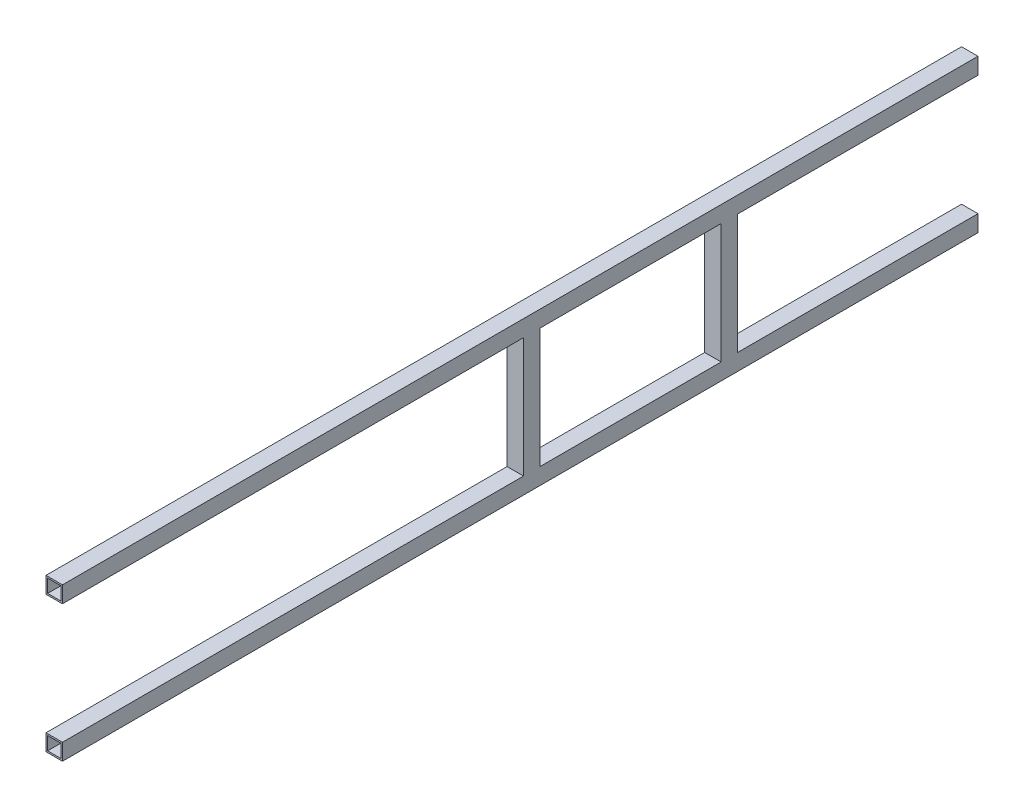
ISO-10303-21;
HEADER;
FILE_DESCRIPTION(('STEP AP214'),'2;1');
FILE_NAME('part.step','',(''),(''),'','','');
FILE_SCHEMA(('AUTOMOTIVE_DESIGN { 1 0 10303 214 1 1 1 1 }'));
ENDSEC;
DATA;
#1=APPLICATION_CONTEXT('core data for automotive mechanical design processes');
#2=APPLICATION_PROTOCOL_DEFINITION('international standard','automotive_design',2000,#1);
#3=PRODUCT_CONTEXT('',#1,'mechanical');
#4=PRODUCT('Part','Part','',(#3));
#5=PRODUCT_RELATED_PRODUCT_CATEGORY('part','',(#4));
#6=PRODUCT_DEFINITION_FORMATION('','',#4);
#7=PRODUCT_DEFINITION_CONTEXT('part definition',#1,'design');
#8=PRODUCT_DEFINITION('design','',#6,#7);
#9=PRODUCT_DEFINITION_SHAPE('','',#8);
#10=(LENGTH_UNIT() NAMED_UNIT(*) SI_UNIT(.MILLI.,.METRE.));
#11=(NAMED_UNIT(*) PLANE_ANGLE_UNIT() SI_UNIT($,.RADIAN.));
#12=(NAMED_UNIT(*) SI_UNIT($,.STERADIAN.) SOLID_ANGLE_UNIT());
#13=UNCERTAINTY_MEASURE_WITH_UNIT(LENGTH_MEASURE(1.E-05),#10,'distance_accuracy_value','');
#14=(GEOMETRIC_REPRESENTATION_CONTEXT(3) GLOBAL_UNCERTAINTY_ASSIGNED_CONTEXT((#13)) GLOBAL_UNIT_ASSIGNED_CONTEXT((#10,
#11,#12)) REPRESENTATION_CONTEXT('',''));
#15=CARTESIAN_POINT('',(0.,0.,0.));
#16=DIRECTION('',(0.,0.,1.));
#17=DIRECTION('',(1.,0.,0.));
#18=AXIS2_PLACEMENT_3D('',#15,#16,#17);
#19=CARTESIAN_POINT('',(-226.590724971136,-123.758693238811,500000.000000032));
#20=DIRECTION('',(1.,0.,0.));
#21=DIRECTION('',(0.,0.,-1.));
#22=AXIS2_PLACEMENT_3D('',#19,#20,#21);
#23=PLANE('',#22);
#24=DIRECTION('',(0.,0.,1.));
#25=VECTOR('',#24,1.);
#26=CARTESIAN_POINT('',(-226.59072497106,-118.745000000152,500000.000000032));
#27=LINE('',#26,#25);
#28=CARTESIAN_POINT('',(-226.590724971098,-118.745000000075,1797.05000000001));
#29=VERTEX_POINT('',#28);
#30=CARTESIAN_POINT('',(-226.590724971079,-118.745000000102,31.7499999999485));
#31=VERTEX_POINT('',#30);
#32=EDGE_CURVE('E222',#29,#31,#27,.F.);
#33=ORIENTED_EDGE('',*,*,#32,.T.);
#34=DIRECTION('',(0.,1.,0.));
#35=VECTOR('',#34,1.);
#36=CARTESIAN_POINT('',(-226.59072497106,0.,31.75));
#37=LINE('',#36,#35);
#38=CARTESIAN_POINT('',(-226.590724971098,-144.145000000076,31.7499999999485));
#39=VERTEX_POINT('',#38);
#40=EDGE_CURVE('E389',#31,#39,#37,.F.);
#41=ORIENTED_EDGE('',*,*,#40,.T.);
#42=DIRECTION('',(0.,0.,-1.));
#43=VECTOR('',#42,1.);
#44=CARTESIAN_POINT('',(-226.59072497106,-144.145000000152,500000.000000032));
#45=LINE('',#44,#43);
#46=CARTESIAN_POINT('',(-226.590724971098,-144.145000000073,1797.05000000001));
#47=VERTEX_POINT('',#46);
#48=EDGE_CURVE('E20',#39,#47,#45,.F.);
#49=ORIENTED_EDGE('',*,*,#48,.T.);
#50=DIRECTION('',(0.,1.,0.));
#51=VECTOR('',#50,1.);
#52=CARTESIAN_POINT('',(-226.59072497106,-500000.000000032,1797.05));
#53=LINE('',#52,#51);
#54=EDGE_CURVE('E377',#29,#47,#53,.F.);
#55=ORIENTED_EDGE('',*,*,#54,.F.);
#56=EDGE_LOOP('',(#33,#41,#49,#55));
#57=FACE_BOUND('',#56,.T.);
#58=ADVANCED_FACE('F17',(#57),#23,.F.);
#59=CARTESIAN_POINT('',(-230.30714613546,-144.145000000152,500000.000000032));
#60=DIRECTION('',(0.,-1.,0.));
#61=DIRECTION('',(0.,0.,-1.));
#62=AXIS2_PLACEMENT_3D('',#59,#60,#61);
#63=PLANE('',#62);
#64=ORIENTED_EDGE('',*,*,#48,.F.);
#65=DIRECTION('',(1.,0.,0.));
#66=VECTOR('',#65,1.);
#67=CARTESIAN_POINT('',(8.96446768580906E-11,-144.145000000051,31.75));
#68=LINE('',#67,#66);
#69=CARTESIAN_POINT('',(-251.990724971111,-144.145000000076,31.7499999999485));
#70=VERTEX_POINT('',#69);
#71=EDGE_CURVE('E387',#39,#70,#68,.F.);
#72=ORIENTED_EDGE('',*,*,#71,.T.);
#73=DIRECTION('',(0.,0.,1.));
#74=VECTOR('',#73,1.);
#75=CARTESIAN_POINT('',(-251.990724971136,-144.145000000051,500000.000000032));
#76=LINE('',#75,#74);
#77=CARTESIAN_POINT('',(-251.990724971098,-144.145000000098,1797.05000000001));
#78=VERTEX_POINT('',#77);
#79=EDGE_CURVE('E223',#70,#78,#76,.T.);
#80=ORIENTED_EDGE('',*,*,#79,.T.);
#81=DIRECTION('',(1.,0.,0.));
#82=VECTOR('',#81,1.);
#83=CARTESIAN_POINT('',(241.414785423032,-144.145000000037,1797.05));
#84=LINE('',#83,#82);
#85=EDGE_CURVE('E375',#47,#78,#84,.F.);
#86=ORIENTED_EDGE('',*,*,#85,.F.);
#87=EDGE_LOOP('',(#64,#72,#80,#86));
#88=FACE_BOUND('',#87,.T.);
#89=ADVANCED_FACE('F897',(#88),#63,.F.);
#90=CARTESIAN_POINT('',(-251.990724971136,-121.154553625105,500000.000000032));
#91=DIRECTION('',(-1.,0.,0.));
#92=DIRECTION('',(0.,0.,1.));
#93=AXIS2_PLACEMENT_3D('',#90,#91,#92);
#94=PLANE('',#93);
#95=ORIENTED_EDGE('',*,*,#79,.F.);
#96=DIRECTION('',(0.,1.,0.));
#97=VECTOR('',#96,1.);
#98=CARTESIAN_POINT('',(-251.990724971085,0.,31.75));
#99=LINE('',#98,#97);
#100=CARTESIAN_POINT('',(-251.990724971111,-118.745000000076,31.7499999999485));
#101=VERTEX_POINT('',#100);
#102=EDGE_CURVE('E394',#70,#101,#99,.T.);
#103=ORIENTED_EDGE('',*,*,#102,.T.);
#104=DIRECTION('',(0.,0.,1.));
#105=VECTOR('',#104,1.);
#106=CARTESIAN_POINT('',(-251.990724971085,-118.745000000152,500000.000000032));
#107=LINE('',#106,#105);
#108=CARTESIAN_POINT('',(-251.990724971111,-118.745000000075,1797.05000000001));
#109=VERTEX_POINT('',#108);
#110=EDGE_CURVE('E219',#101,#109,#107,.T.);
#111=ORIENTED_EDGE('',*,*,#110,.T.);
#112=DIRECTION('',(0.,1.,0.));
#113=VECTOR('',#112,1.);
#114=CARTESIAN_POINT('',(-251.990724971085,-500000.000000032,1797.05));
#115=LINE('',#114,#113);
#116=EDGE_CURVE('E373',#78,#109,#115,.T.);
#117=ORIENTED_EDGE('',*,*,#116,.F.);
#118=EDGE_LOOP('',(#95,#103,#111,#117));
#119=FACE_BOUND('',#118,.T.);
#120=ADVANCED_FACE('F437',(#119),#94,.F.);
#121=CARTESIAN_POINT('',(-230.169269958914,-118.745000000152,500000.000000032));
#122=DIRECTION('',(0.,1.,0.));
#123=DIRECTION('',(0.,0.,1.));
#124=AXIS2_PLACEMENT_3D('',#121,#122,#123);
#125=PLANE('',#124);
#126=ORIENTED_EDGE('',*,*,#110,.F.);
#127=DIRECTION('',(1.,0.,0.));
#128=VECTOR('',#127,1.);
#129=CARTESIAN_POINT('',(8.96446768580906E-11,-118.745000000051,31.75));
#130=LINE('',#129,#128);
#131=EDGE_CURVE('E391',#101,#31,#130,.T.);
#132=ORIENTED_EDGE('',*,*,#131,.T.);
#133=ORIENTED_EDGE('',*,*,#32,.F.);
#134=DIRECTION('',(1.,0.,0.));
#135=VECTOR('',#134,1.);
#136=CARTESIAN_POINT('',(241.414785423032,-118.745000000047,1797.05));
#137=LINE('',#136,#135);
#138=EDGE_CURVE('E370',#109,#29,#137,.T.);
#139=ORIENTED_EDGE('',*,*,#138,.F.);
#140=EDGE_LOOP('',(#126,#132,#133,#139));
#141=FACE_BOUND('',#140,.T.);
#142=ADVANCED_FACE('F429',(#141),#125,.F.);
#143=CARTESIAN_POINT('',(-251.990724971136,121.154553624774,500000.000000032));
#144=DIRECTION('',(1.,0.,0.));
#145=DIRECTION('',(0.,0.,-1.));
#146=AXIS2_PLACEMENT_3D('',#143,#144,#145);
#147=PLANE('',#146);
#148=DIRECTION('',(0.,0.,1.));
#149=VECTOR('',#148,1.);
#150=CARTESIAN_POINT('',(-251.990724971085,118.744999999848,500000.000000032));
#151=LINE('',#150,#149);
#152=CARTESIAN_POINT('',(-251.990724971098,118.744999999898,31.7499999999485));
#153=VERTEX_POINT('',#152);
#154=CARTESIAN_POINT('',(-251.990724971111,118.74499999992,1797.05000000001));
#155=VERTEX_POINT('',#154);
#156=EDGE_CURVE('E188',#153,#155,#151,.T.);
#157=ORIENTED_EDGE('',*,*,#156,.F.);
#158=DIRECTION('',(0.,1.,0.));
#159=VECTOR('',#158,1.);
#160=CARTESIAN_POINT('',(-251.990724971085,0.,31.75));
#161=LINE('',#160,#159);
#162=CARTESIAN_POINT('',(-251.990724971098,144.144999999898,31.7499999999485));
#163=VERTEX_POINT('',#162);
#164=EDGE_CURVE('E418',#153,#163,#161,.T.);
#165=ORIENTED_EDGE('',*,*,#164,.T.);
#166=DIRECTION('',(0.,0.,-1.));
#167=VECTOR('',#166,1.);
#168=CARTESIAN_POINT('',(-251.990724971085,144.144999999848,500000.000000032));
#169=LINE('',#168,#167);
#170=CARTESIAN_POINT('',(-251.990724971111,144.144999999917,1797.05000000001));
#171=VERTEX_POINT('',#170);
#172=EDGE_CURVE('E189',#171,#163,#169,.T.);
#173=ORIENTED_EDGE('',*,*,#172,.F.);
#174=DIRECTION('',(0.,1.,0.));
#175=VECTOR('',#174,1.);
#176=CARTESIAN_POINT('',(-251.990724971085,-500000.000000032,1797.05));
#177=LINE('',#176,#175);
#178=EDGE_CURVE('E346',#155,#171,#177,.T.);
#179=ORIENTED_EDGE('',*,*,#178,.F.);
#180=EDGE_LOOP('',(#157,#165,#173,#179));
#181=FACE_BOUND('',#180,.T.);
#182=ADVANCED_FACE('F427',(#181),#147,.T.);
#183=CARTESIAN_POINT('',(-230.30714613546,144.144999999848,500000.000000032));
#184=DIRECTION('',(0.,-1.,0.));
#185=DIRECTION('',(0.,0.,-1.));
#186=AXIS2_PLACEMENT_3D('',#183,#184,#185);
#187=PLANE('',#186);
#188=ORIENTED_EDGE('',*,*,#172,.T.);
#189=DIRECTION('',(1.,0.,0.));
#190=VECTOR('',#189,1.);
#191=CARTESIAN_POINT('',(8.96446768580906E-11,144.144999999949,31.75));
#192=LINE('',#191,#190);
#193=CARTESIAN_POINT('',(-226.590724971079,144.144999999898,31.7499999999485));
#194=VERTEX_POINT('',#193);
#195=EDGE_CURVE('E197',#163,#194,#192,.T.);
#196=ORIENTED_EDGE('',*,*,#195,.T.);
#197=DIRECTION('',(0.,0.,1.));
#198=VECTOR('',#197,1.);
#199=CARTESIAN_POINT('',(-226.590724971136,144.144999999949,500000.000000032));
#200=LINE('',#199,#198);
#201=CARTESIAN_POINT('',(-226.590724971079,144.144999999892,1797.05000000001));
#202=VERTEX_POINT('',#201);
#203=EDGE_CURVE('E179',#202,#194,#200,.F.);
#204=ORIENTED_EDGE('',*,*,#203,.F.);
#205=DIRECTION('',(1.,0.,0.));
#206=VECTOR('',#205,1.);
#207=CARTESIAN_POINT('',(241.414785423032,144.144999999924,1797.05));
#208=LINE('',#207,#206);
#209=EDGE_CURVE('E344',#171,#202,#208,.T.);
#210=ORIENTED_EDGE('',*,*,#209,.F.);
#211=EDGE_LOOP('',(#188,#196,#204,#210));
#212=FACE_BOUND('',#211,.T.);
#213=ADVANCED_FACE('F202',(#212),#187,.T.);
#214=CARTESIAN_POINT('',(-226.590724971136,123.758693238507,500000.000000032));
#215=DIRECTION('',(-1.,0.,0.));
#216=DIRECTION('',(0.,0.,1.));
#217=AXIS2_PLACEMENT_3D('',#214,#215,#216);
#218=PLANE('',#217);
#219=ORIENTED_EDGE('',*,*,#203,.T.);
#220=DIRECTION('',(0.,1.,0.));
#221=VECTOR('',#220,1.);
#222=CARTESIAN_POINT('',(-226.59072497106,0.,31.75));
#223=LINE('',#222,#221);
#224=CARTESIAN_POINT('',(-226.590724971098,118.744999999924,31.7499999999485));
#225=VERTEX_POINT('',#224);
#226=EDGE_CURVE('E183',#194,#225,#223,.F.);
#227=ORIENTED_EDGE('',*,*,#226,.T.);
#228=DIRECTION('',(0.,0.,1.));
#229=VECTOR('',#228,1.);
#230=CARTESIAN_POINT('',(-226.59072497106,118.744999999848,500000.000000032));
#231=LINE('',#230,#229);
#232=CARTESIAN_POINT('',(-226.590724971098,118.74499999992,1797.05000000001));
#233=VERTEX_POINT('',#232);
#234=EDGE_CURVE('E215',#233,#225,#231,.F.);
#235=ORIENTED_EDGE('',*,*,#234,.F.);
#236=DIRECTION('',(0.,1.,0.));
#237=VECTOR('',#236,1.);
#238=CARTESIAN_POINT('',(-226.59072497106,-500000.000000032,1797.05));
#239=LINE('',#238,#237);
#240=EDGE_CURVE('E184',#202,#233,#239,.F.);
#241=ORIENTED_EDGE('',*,*,#240,.F.);
#242=EDGE_LOOP('',(#219,#227,#235,#241));
#243=FACE_BOUND('',#242,.T.);
#244=ADVANCED_FACE('F181',(#243),#218,.T.);
#245=CARTESIAN_POINT('',(-230.169269958914,118.744999999848,500000.000000032));
#246=DIRECTION('',(0.,1.,0.));
#247=DIRECTION('',(0.,0.,1.));
#248=AXIS2_PLACEMENT_3D('',#245,#246,#247);
#249=PLANE('',#248);
#250=ORIENTED_EDGE('',*,*,#234,.T.);
#251=DIRECTION('',(1.,0.,0.));
#252=VECTOR('',#251,1.);
#253=CARTESIAN_POINT('',(8.96446768580906E-11,118.744999999949,31.75));
#254=LINE('',#253,#252);
#255=EDGE_CURVE('E200',#225,#153,#254,.F.);
#256=ORIENTED_EDGE('',*,*,#255,.T.);
#257=ORIENTED_EDGE('',*,*,#156,.T.);
#258=DIRECTION('',(1.,0.,0.));
#259=VECTOR('',#258,1.);
#260=CARTESIAN_POINT('',(241.414785423032,118.744999999933,1797.05));
#261=LINE('',#260,#259);
#262=EDGE_CURVE('E340',#233,#155,#261,.F.);
#263=ORIENTED_EDGE('',*,*,#262,.F.);
#264=EDGE_LOOP('',(#250,#256,#257,#263));
#265=FACE_BOUND('',#264,.T.);
#266=ADVANCED_FACE('F420',(#265),#249,.T.);
#267=CARTESIAN_POINT('',(-255.16572497106,121.154553624774,500000.000000032));
#268=DIRECTION('',(1.,0.,0.));
#269=DIRECTION('',(0.,0.,-1.));
#270=AXIS2_PLACEMENT_3D('',#267,#268,#269);
#271=PLANE('',#270);
#272=DIRECTION('',(0.,1.,0.));
#273=VECTOR('',#272,1.);
#274=CARTESIAN_POINT('',(-255.16572497106,-577125.010845068,876.3));
#275=LINE('',#274,#273);
#276=CARTESIAN_POINT('',(-255.16572497106,115.569999999895,876.300000000011));
#277=VERTEX_POINT('',#276);
#278=CARTESIAN_POINT('',(-255.16572497106,-115.570000000088,876.300000000011));
#279=VERTEX_POINT('',#278);
#280=EDGE_CURVE('E324',#277,#279,#275,.F.);
#281=ORIENTED_EDGE('',*,*,#280,.T.);
#282=DIRECTION('',(0.,0.,1.));
#283=VECTOR('',#282,1.);
#284=CARTESIAN_POINT('',(-255.16572497106,-115.570000000152,500000.000000032));
#285=LINE('',#284,#283);
#286=CARTESIAN_POINT('',(-255.16572497106,-115.570000000107,527.049999999981));
#287=VERTEX_POINT('',#286);
#288=EDGE_CURVE('E338',#287,#279,#285,.T.);
#289=ORIENTED_EDGE('',*,*,#288,.F.);
#290=DIRECTION('',(0.,1.,0.));
#291=VECTOR('',#290,1.);
#292=CARTESIAN_POINT('',(-255.16572497106,-577106.691800277,527.05));
#293=LINE('',#292,#291);
#294=CARTESIAN_POINT('',(-255.16572497106,115.569999999916,527.049999999987));
#295=VERTEX_POINT('',#294);
#296=EDGE_CURVE('E333',#295,#287,#293,.F.);
#297=ORIENTED_EDGE('',*,*,#296,.F.);
#298=DIRECTION('',(0.,0.,1.));
#299=VECTOR('',#298,1.);
#300=CARTESIAN_POINT('',(-255.16572497106,115.569999999848,500000.000000032));
#301=LINE('',#300,#299);
#302=EDGE_CURVE('E328',#295,#277,#301,.T.);
#303=ORIENTED_EDGE('',*,*,#302,.T.);
#304=EDGE_LOOP('',(#281,#289,#297,#303));
#305=FACE_BOUND('',#304,.T.);
#306=DIRECTION('',(0.,0.,-1.));
#307=VECTOR('',#306,1.);
#308=CARTESIAN_POINT('',(-255.16572497106,147.319999999848,500000.000000032));
#309=LINE('',#308,#307);
#310=CARTESIAN_POINT('',(-255.16572497106,147.319999999892,1797.05000000001));
#311=VERTEX_POINT('',#310);
#312=CARTESIAN_POINT('',(-255.16572497106,147.319999999924,31.7499999999485));
#313=VERTEX_POINT('',#312);
#314=EDGE_CURVE('E212',#311,#313,#309,.T.);
#315=ORIENTED_EDGE('',*,*,#314,.T.);
#316=DIRECTION('',(0.,1.,0.));
#317=VECTOR('',#316,1.);
#318=CARTESIAN_POINT('',(-255.16572497106,0.,31.75));
#319=LINE('',#318,#317);
#320=CARTESIAN_POINT('',(-255.16572497106,115.569999999905,31.7499999999657));
#321=VERTEX_POINT('',#320);
#322=EDGE_CURVE('E207',#313,#321,#319,.F.);
#323=ORIENTED_EDGE('',*,*,#322,.T.);
#324=DIRECTION('',(0.,0.,1.));
#325=VECTOR('',#324,1.);
#326=CARTESIAN_POINT('',(-255.16572497106,115.569999999848,500000.000000032));
#327=LINE('',#326,#325);
#328=CARTESIAN_POINT('',(-255.16572497106,115.569999999876,495.29999999999));
#329=VERTEX_POINT('',#328);
#330=EDGE_CURVE('E413',#321,#329,#327,.T.);
#331=ORIENTED_EDGE('',*,*,#330,.T.);
#332=DIRECTION('',(0.,1.,0.));
#333=VECTOR('',#332,1.);
#334=CARTESIAN_POINT('',(-255.16572497106,-577106.691800277,495.3));
#335=LINE('',#334,#333);
#336=CARTESIAN_POINT('',(-255.16572497106,-115.570000000075,495.299999999993));
#337=VERTEX_POINT('',#336);
#338=EDGE_CURVE('E408',#329,#337,#335,.F.);
#339=ORIENTED_EDGE('',*,*,#338,.T.);
#340=DIRECTION('',(0.,0.,1.));
#341=VECTOR('',#340,1.);
#342=CARTESIAN_POINT('',(-255.16572497106,-115.570000000152,500000.000000032));
#343=LINE('',#342,#341);
#344=CARTESIAN_POINT('',(-255.16572497106,-115.570000000102,31.7499999999485));
#345=VERTEX_POINT('',#344);
#346=EDGE_CURVE('E403',#345,#337,#343,.T.);
#347=ORIENTED_EDGE('',*,*,#346,.F.);
#348=DIRECTION('',(0.,1.,0.));
#349=VECTOR('',#348,1.);
#350=CARTESIAN_POINT('',(-255.16572497106,0.,31.75));
#351=LINE('',#350,#349);
#352=CARTESIAN_POINT('',(-255.16572497106,-147.320000000076,31.7499999999485));
#353=VERTEX_POINT('',#352);
#354=EDGE_CURVE('E397',#345,#353,#351,.F.);
#355=ORIENTED_EDGE('',*,*,#354,.T.);
#356=DIRECTION('',(0.,0.,-1.));
#357=VECTOR('',#356,1.);
#358=CARTESIAN_POINT('',(-255.16572497106,-147.320000000152,500000.000000032));
#359=LINE('',#358,#357);
#360=CARTESIAN_POINT('',(-255.16572497106,-147.320000000073,1797.05000000001));
#361=VERTEX_POINT('',#360);
#362=EDGE_CURVE('E385',#361,#353,#359,.T.);
#363=ORIENTED_EDGE('',*,*,#362,.F.);
#364=DIRECTION('',(0.,1.,0.));
#365=VECTOR('',#364,1.);
#366=CARTESIAN_POINT('',(-255.16572497106,-500000.000000032,1797.05));
#367=LINE('',#366,#365);
#368=CARTESIAN_POINT('',(-255.16572497106,-115.570000000088,1797.05000000001));
#369=VERTEX_POINT('',#368);
#370=EDGE_CURVE('E381',#369,#361,#367,.F.);
#371=ORIENTED_EDGE('',*,*,#370,.F.);
#372=DIRECTION('',(0.,0.,1.));
#373=VECTOR('',#372,1.);
#374=CARTESIAN_POINT('',(-255.16572497106,-115.570000000152,500000.000000032));
#375=LINE('',#374,#373);
#376=CARTESIAN_POINT('',(-255.16572497106,-115.570000000107,908.050000000002));
#377=VERTEX_POINT('',#376);
#378=EDGE_CURVE('E368',#377,#369,#375,.T.);
#379=ORIENTED_EDGE('',*,*,#378,.F.);
#380=DIRECTION('',(0.,1.,0.));
#381=VECTOR('',#380,1.);
#382=CARTESIAN_POINT('',(-255.16572497106,-577125.010845068,908.05));
#383=LINE('',#382,#381);
#384=CARTESIAN_POINT('',(-255.16572497106,115.569999999916,908.050000000001));
#385=VERTEX_POINT('',#384);
#386=EDGE_CURVE('E361',#385,#377,#383,.F.);
#387=ORIENTED_EDGE('',*,*,#386,.F.);
#388=DIRECTION('',(0.,0.,1.));
#389=VECTOR('',#388,1.);
#390=CARTESIAN_POINT('',(-255.16572497106,115.569999999848,500000.000000032));
#391=LINE('',#390,#389);
#392=CARTESIAN_POINT('',(-255.16572497106,115.56999999992,1797.05000000001));
#393=VERTEX_POINT('',#392);
#394=EDGE_CURVE('E355',#385,#393,#391,.T.);
#395=ORIENTED_EDGE('',*,*,#394,.T.);
#396=DIRECTION('',(0.,1.,0.));
#397=VECTOR('',#396,1.);
#398=CARTESIAN_POINT('',(-255.16572497106,-500000.000000032,1797.05));
#399=LINE('',#398,#397);
#400=EDGE_CURVE('E350',#311,#393,#399,.F.);
#401=ORIENTED_EDGE('',*,*,#400,.F.);
#402=EDGE_LOOP('',(#315,#323,#331,#339,#347,#355,#363,#371,#379,#387,#395,#401));
#403=FACE_BOUND('',#402,.T.);
#404=ADVANCED_FACE('F511',(#305,#403),#271,.F.);
#405=CARTESIAN_POINT('',(-230.30714613546,147.319999999848,500000.000000032));
#406=DIRECTION('',(0.,-1.,0.));
#407=DIRECTION('',(0.,0.,-1.));
#408=AXIS2_PLACEMENT_3D('',#405,#406,#407);
#409=PLANE('',#408);
#410=DIRECTION('',(0.,0.,1.));
#411=VECTOR('',#410,1.);
#412=CARTESIAN_POINT('',(-223.415724971136,147.319999999949,500000.000000032));
#413=LINE('',#412,#411);
#414=CARTESIAN_POINT('',(-223.415724971085,147.319999999892,1797.05000000001));
#415=VERTEX_POINT('',#414);
#416=CARTESIAN_POINT('',(-223.415724971085,147.319999999898,31.7499999999485));
#417=VERTEX_POINT('',#416);
#418=EDGE_CURVE('E318',#415,#417,#413,.F.);
#419=ORIENTED_EDGE('',*,*,#418,.T.);
#420=DIRECTION('',(1.,0.,0.));
#421=VECTOR('',#420,1.);
#422=CARTESIAN_POINT('',(8.96446768580906E-11,147.319999999949,31.75));
#423=LINE('',#422,#421);
#424=EDGE_CURVE('E204',#417,#313,#423,.F.);
#425=ORIENTED_EDGE('',*,*,#424,.T.);
#426=ORIENTED_EDGE('',*,*,#314,.F.);
#427=DIRECTION('',(1.,0.,0.));
#428=VECTOR('',#427,1.);
#429=CARTESIAN_POINT('',(241.414785423032,147.319999999922,1797.05));
#430=LINE('',#429,#428);
#431=EDGE_CURVE('E352',#415,#311,#430,.F.);
#432=ORIENTED_EDGE('',*,*,#431,.F.);
#433=EDGE_LOOP('',(#419,#425,#426,#432));
#434=FACE_BOUND('',#433,.T.);
#435=ADVANCED_FACE('F508',(#434),#409,.F.);
#436=CARTESIAN_POINT('',(8.96446768580906E-11,0.,31.75));
#437=DIRECTION('',(0.,0.,1.));
#438=DIRECTION('',(1.,0.,0.));
#439=AXIS2_PLACEMENT_3D('',#436,#437,#438);
#440=PLANE('',#439);
#441=ORIENTED_EDGE('',*,*,#255,.F.);
#442=ORIENTED_EDGE('',*,*,#226,.F.);
#443=ORIENTED_EDGE('',*,*,#195,.F.);
#444=ORIENTED_EDGE('',*,*,#164,.F.);
#445=EDGE_LOOP('',(#441,#442,#443,#444));
#446=FACE_BOUND('',#445,.T.);
#447=DIRECTION('',(0.,1.,0.));
#448=VECTOR('',#447,1.);
#449=CARTESIAN_POINT('',(-223.415724971136,123.758693238507,31.7499999999313));
#450=LINE('',#449,#448);
#451=CARTESIAN_POINT('',(-223.415724971092,115.569999999924,31.7499999999657));
#452=VERTEX_POINT('',#451);
#453=EDGE_CURVE('E315',#417,#452,#450,.F.);
#454=ORIENTED_EDGE('',*,*,#453,.T.);
#455=DIRECTION('',(1.,0.,0.));
#456=VECTOR('',#455,1.);
#457=CARTESIAN_POINT('',(-230.169269958914,115.569999999848,31.7499999999313));
#458=LINE('',#457,#456);
#459=EDGE_CURVE('E415',#452,#321,#458,.F.);
#460=ORIENTED_EDGE('',*,*,#459,.T.);
#461=ORIENTED_EDGE('',*,*,#322,.F.);
#462=ORIENTED_EDGE('',*,*,#424,.F.);
#463=EDGE_LOOP('',(#454,#460,#461,#462));
#464=FACE_BOUND('',#463,.T.);
#465=ADVANCED_FACE('F194',(#446,#464),#440,.F.);
#466=CARTESIAN_POINT('',(-230.169269958914,115.569999999848,500000.000000032));
#467=DIRECTION('',(0.,1.,0.));
#468=DIRECTION('',(0.,0.,1.));
#469=AXIS2_PLACEMENT_3D('',#466,#467,#468);
#470=PLANE('',#469);
#471=ORIENTED_EDGE('',*,*,#330,.F.);
#472=ORIENTED_EDGE('',*,*,#459,.F.);
#473=DIRECTION('',(0.,0.,1.));
#474=VECTOR('',#473,1.);
#475=CARTESIAN_POINT('',(-223.415724971136,115.569999999949,500000.000000032));
#476=LINE('',#475,#474);
#477=CARTESIAN_POINT('',(-223.415724971079,115.569999999895,495.29999999999));
#478=VERTEX_POINT('',#477);
#479=EDGE_CURVE('E312',#452,#478,#476,.T.);
#480=ORIENTED_EDGE('',*,*,#479,.T.);
#481=DIRECTION('',(1.,0.,0.));
#482=VECTOR('',#481,1.);
#483=CARTESIAN_POINT('',(-239.136344166303,115.569999999934,495.3));
#484=LINE('',#483,#482);
#485=EDGE_CURVE('E410',#478,#329,#484,.F.);
#486=ORIENTED_EDGE('',*,*,#485,.T.);
#487=EDGE_LOOP('',(#471,#472,#480,#486));
#488=FACE_BOUND('',#487,.T.);
#489=ADVANCED_FACE('F501',(#488),#470,.F.);
#490=CARTESIAN_POINT('',(-239.136344166303,-577106.691800277,495.3));
#491=DIRECTION('',(0.,0.,1.));
#492=DIRECTION('',(1.,0.,0.));
#493=AXIS2_PLACEMENT_3D('',#490,#491,#492);
#494=PLANE('',#493);
#495=DIRECTION('',(1.,0.,0.));
#496=VECTOR('',#495,1.);
#497=CARTESIAN_POINT('',(-230.169269958914,-115.570000000152,495.299999999986));
#498=LINE('',#497,#496);
#499=CARTESIAN_POINT('',(-223.415724971079,-115.570000000075,495.299999999993));
#500=VERTEX_POINT('',#499);
#501=EDGE_CURVE('E406',#337,#500,#498,.T.);
#502=ORIENTED_EDGE('',*,*,#501,.F.);
#503=ORIENTED_EDGE('',*,*,#338,.F.);
#504=ORIENTED_EDGE('',*,*,#485,.F.);
#505=DIRECTION('',(0.,1.,0.));
#506=VECTOR('',#505,1.);
#507=CARTESIAN_POINT('',(-223.415724971136,123.758693238507,495.299999999986));
#508=LINE('',#507,#506);
#509=EDGE_CURVE('E309',#478,#500,#508,.F.);
#510=ORIENTED_EDGE('',*,*,#509,.T.);
#511=EDGE_LOOP('',(#502,#503,#504,#510));
#512=FACE_BOUND('',#511,.T.);
#513=ADVANCED_FACE('F497',(#512),#494,.F.);
#514=CARTESIAN_POINT('',(-230.169269958914,-115.570000000152,500000.000000032));
#515=DIRECTION('',(0.,1.,0.));
#516=DIRECTION('',(0.,0.,1.));
#517=AXIS2_PLACEMENT_3D('',#514,#515,#516);
#518=PLANE('',#517);
#519=DIRECTION('',(1.,0.,0.));
#520=VECTOR('',#519,1.);
#521=CARTESIAN_POINT('',(8.96446768580906E-11,-115.570000000051,31.75));
#522=LINE('',#521,#520);
#523=CARTESIAN_POINT('',(-223.415724971079,-115.570000000102,31.7499999999485));
#524=VERTEX_POINT('',#523);
#525=EDGE_CURVE('E400',#524,#345,#522,.F.);
#526=ORIENTED_EDGE('',*,*,#525,.T.);
#527=ORIENTED_EDGE('',*,*,#346,.T.);
#528=ORIENTED_EDGE('',*,*,#501,.T.);
#529=DIRECTION('',(0.,0.,1.));
#530=VECTOR('',#529,1.);
#531=CARTESIAN_POINT('',(-223.415724971136,-115.570000000051,500000.000000032));
#532=LINE('',#531,#530);
#533=EDGE_CURVE('E306',#500,#524,#532,.F.);
#534=ORIENTED_EDGE('',*,*,#533,.T.);
#535=EDGE_LOOP('',(#526,#527,#528,#534));
#536=FACE_BOUND('',#535,.T.);
#537=ADVANCED_FACE('F493',(#536),#518,.T.);
#538=CARTESIAN_POINT('',(8.96446768580906E-11,0.,31.75));
#539=DIRECTION('',(0.,0.,1.));
#540=DIRECTION('',(1.,0.,0.));
#541=AXIS2_PLACEMENT_3D('',#538,#539,#540);
#542=PLANE('',#541);
#543=ORIENTED_EDGE('',*,*,#40,.F.);
#544=ORIENTED_EDGE('',*,*,#131,.F.);
#545=ORIENTED_EDGE('',*,*,#102,.F.);
#546=ORIENTED_EDGE('',*,*,#71,.F.);
#547=EDGE_LOOP('',(#543,#544,#545,#546));
#548=FACE_BOUND('',#547,.T.);
#549=DIRECTION('',(1.,0.,0.));
#550=VECTOR('',#549,1.);
#551=CARTESIAN_POINT('',(-230.30714613546,-147.320000000152,31.7499999999313));
#552=LINE('',#551,#550);
#553=CARTESIAN_POINT('',(-223.415724971079,-147.320000000076,31.7499999999657));
#554=VERTEX_POINT('',#553);
#555=EDGE_CURVE('E383',#353,#554,#552,.T.);
#556=ORIENTED_EDGE('',*,*,#555,.F.);
#557=ORIENTED_EDGE('',*,*,#354,.F.);
#558=ORIENTED_EDGE('',*,*,#525,.F.);
#559=DIRECTION('',(0.,1.,0.));
#560=VECTOR('',#559,1.);
#561=CARTESIAN_POINT('',(-223.415724971136,123.758693238507,31.7499999999313));
#562=LINE('',#561,#560);
#563=EDGE_CURVE('E303',#524,#554,#562,.F.);
#564=ORIENTED_EDGE('',*,*,#563,.T.);
#565=EDGE_LOOP('',(#556,#557,#558,#564));
#566=FACE_BOUND('',#565,.T.);
#567=ADVANCED_FACE('F489',(#548,#566),#542,.F.);
#568=CARTESIAN_POINT('',(-230.30714613546,-147.320000000152,500000.000000032));
#569=DIRECTION('',(0.,-1.,0.));
#570=DIRECTION('',(0.,0.,-1.));
#571=AXIS2_PLACEMENT_3D('',#568,#569,#570);
#572=PLANE('',#571);
#573=ORIENTED_EDGE('',*,*,#362,.T.);
#574=ORIENTED_EDGE('',*,*,#555,.T.);
#575=DIRECTION('',(0.,0.,1.));
#576=VECTOR('',#575,1.);
#577=CARTESIAN_POINT('',(-223.415724971136,-147.320000000051,500000.000000032));
#578=LINE('',#577,#576);
#579=CARTESIAN_POINT('',(-223.415724971079,-147.320000000098,1797.05000000001));
#580=VERTEX_POINT('',#579);
#581=EDGE_CURVE('E300',#554,#580,#578,.T.);
#582=ORIENTED_EDGE('',*,*,#581,.T.);
#583=DIRECTION('',(1.,0.,0.));
#584=VECTOR('',#583,1.);
#585=CARTESIAN_POINT('',(241.414785423032,-147.320000000036,1797.05));
#586=LINE('',#585,#584);
#587=EDGE_CURVE('E379',#361,#580,#586,.T.);
#588=ORIENTED_EDGE('',*,*,#587,.F.);
#589=EDGE_LOOP('',(#573,#574,#582,#588));
#590=FACE_BOUND('',#589,.T.);
#591=ADVANCED_FACE('F485',(#590),#572,.T.);
#592=CARTESIAN_POINT('',(241.414785423032,-500000.000000032,1797.05));
#593=DIRECTION('',(0.,0.,1.));
#594=DIRECTION('',(1.,0.,0.));
#595=AXIS2_PLACEMENT_3D('',#592,#593,#594);
#596=PLANE('',#595);
#597=ORIENTED_EDGE('',*,*,#116,.T.);
#598=ORIENTED_EDGE('',*,*,#138,.T.);
#599=ORIENTED_EDGE('',*,*,#54,.T.);
#600=ORIENTED_EDGE('',*,*,#85,.T.);
#601=EDGE_LOOP('',(#597,#598,#599,#600));
#602=FACE_BOUND('',#601,.T.);
#603=ORIENTED_EDGE('',*,*,#370,.T.);
#604=ORIENTED_EDGE('',*,*,#587,.T.);
#605=DIRECTION('',(0.,1.,0.));
#606=VECTOR('',#605,1.);
#607=CARTESIAN_POINT('',(-223.415724971136,123.758693238507,1797.05000000001));
#608=LINE('',#607,#606);
#609=CARTESIAN_POINT('',(-223.415724971085,-115.570000000068,1797.05000000001));
#610=VERTEX_POINT('',#609);
#611=EDGE_CURVE('E297',#580,#610,#608,.T.);
#612=ORIENTED_EDGE('',*,*,#611,.T.);
#613=DIRECTION('',(1.,0.,0.));
#614=VECTOR('',#613,1.);
#615=CARTESIAN_POINT('',(-230.169269958914,-115.570000000152,1797.05000000001));
#616=LINE('',#615,#614);
#617=EDGE_CURVE('E366',#369,#610,#616,.T.);
#618=ORIENTED_EDGE('',*,*,#617,.F.);
#619=EDGE_LOOP('',(#603,#604,#612,#618));
#620=FACE_BOUND('',#619,.T.);
#621=ADVANCED_FACE('F481',(#602,#620),#596,.T.);
#622=CARTESIAN_POINT('',(-230.169269958914,-115.570000000152,500000.000000032));
#623=DIRECTION('',(0.,1.,0.));
#624=DIRECTION('',(0.,0.,1.));
#625=AXIS2_PLACEMENT_3D('',#622,#623,#624);
#626=PLANE('',#625);
#627=ORIENTED_EDGE('',*,*,#378,.T.);
#628=ORIENTED_EDGE('',*,*,#617,.T.);
#629=DIRECTION('',(0.,0.,1.));
#630=VECTOR('',#629,1.);
#631=CARTESIAN_POINT('',(-223.415724971136,-115.570000000025,500000.000000032));
#632=LINE('',#631,#630);
#633=CARTESIAN_POINT('',(-223.415724971092,-115.570000000095,908.050000000002));
#634=VERTEX_POINT('',#633);
#635=EDGE_CURVE('E294',#610,#634,#632,.F.);
#636=ORIENTED_EDGE('',*,*,#635,.T.);
#637=DIRECTION('',(1.,0.,0.));
#638=VECTOR('',#637,1.);
#639=CARTESIAN_POINT('',(-239.136344166328,-115.570000000048,908.05));
#640=LINE('',#639,#638);
#641=EDGE_CURVE('E364',#377,#634,#640,.T.);
#642=ORIENTED_EDGE('',*,*,#641,.F.);
#643=EDGE_LOOP('',(#627,#628,#636,#642));
#644=FACE_BOUND('',#643,.T.);
#645=ADVANCED_FACE('F477',(#644),#626,.T.);
#646=CARTESIAN_POINT('',(-239.136344166328,-577125.010845068,908.05));
#647=DIRECTION('',(0.,0.,1.));
#648=DIRECTION('',(1.,0.,0.));
#649=AXIS2_PLACEMENT_3D('',#646,#647,#648);
#650=PLANE('',#649);
#651=DIRECTION('',(1.,0.,0.));
#652=VECTOR('',#651,1.);
#653=CARTESIAN_POINT('',(-230.169269958914,115.569999999848,908.050000000003));
#654=LINE('',#653,#652);
#655=CARTESIAN_POINT('',(-223.415724971085,115.569999999916,908.050000000001));
#656=VERTEX_POINT('',#655);
#657=EDGE_CURVE('E358',#656,#385,#654,.F.);
#658=ORIENTED_EDGE('',*,*,#657,.T.);
#659=ORIENTED_EDGE('',*,*,#386,.T.);
#660=ORIENTED_EDGE('',*,*,#641,.T.);
#661=DIRECTION('',(0.,1.,0.));
#662=VECTOR('',#661,1.);
#663=CARTESIAN_POINT('',(-223.415724971136,123.758693238507,908.050000000003));
#664=LINE('',#663,#662);
#665=EDGE_CURVE('E291',#634,#656,#664,.T.);
#666=ORIENTED_EDGE('',*,*,#665,.T.);
#667=EDGE_LOOP('',(#658,#659,#660,#666));
#668=FACE_BOUND('',#667,.T.);
#669=ADVANCED_FACE('F473',(#668),#650,.T.);
#670=CARTESIAN_POINT('',(-230.169269958914,115.569999999848,500000.000000032));
#671=DIRECTION('',(0.,1.,0.));
#672=DIRECTION('',(0.,0.,1.));
#673=AXIS2_PLACEMENT_3D('',#670,#671,#672);
#674=PLANE('',#673);
#675=ORIENTED_EDGE('',*,*,#657,.F.);
#676=DIRECTION('',(0.,0.,1.));
#677=VECTOR('',#676,1.);
#678=CARTESIAN_POINT('',(-223.415724971136,115.569999999949,500000.000000032));
#679=LINE('',#678,#677);
#680=CARTESIAN_POINT('',(-223.415724971098,115.569999999895,1797.05000000001));
#681=VERTEX_POINT('',#680);
#682=EDGE_CURVE('E288',#656,#681,#679,.T.);
#683=ORIENTED_EDGE('',*,*,#682,.T.);
#684=DIRECTION('',(1.,0.,0.));
#685=VECTOR('',#684,1.);
#686=CARTESIAN_POINT('',(241.414785423032,115.569999999934,1797.05));
#687=LINE('',#686,#685);
#688=EDGE_CURVE('E348',#393,#681,#687,.T.);
#689=ORIENTED_EDGE('',*,*,#688,.F.);
#690=ORIENTED_EDGE('',*,*,#394,.F.);
#691=EDGE_LOOP('',(#675,#683,#689,#690));
#692=FACE_BOUND('',#691,.T.);
#693=ADVANCED_FACE('F470',(#692),#674,.F.);
#694=CARTESIAN_POINT('',(241.414785423032,-500000.000000032,1797.05));
#695=DIRECTION('',(0.,0.,1.));
#696=DIRECTION('',(1.,0.,0.));
#697=AXIS2_PLACEMENT_3D('',#694,#695,#696);
#698=PLANE('',#697);
#699=ORIENTED_EDGE('',*,*,#240,.T.);
#700=ORIENTED_EDGE('',*,*,#262,.T.);
#701=ORIENTED_EDGE('',*,*,#178,.T.);
#702=ORIENTED_EDGE('',*,*,#209,.T.);
#703=EDGE_LOOP('',(#699,#700,#701,#702));
#704=FACE_BOUND('',#703,.T.);
#705=ORIENTED_EDGE('',*,*,#400,.T.);
#706=ORIENTED_EDGE('',*,*,#688,.T.);
#707=DIRECTION('',(0.,1.,0.));
#708=VECTOR('',#707,1.);
#709=CARTESIAN_POINT('',(-223.415724971136,123.758693238507,1797.05000000001));
#710=LINE('',#709,#708);
#711=EDGE_CURVE('E285',#681,#415,#710,.T.);
#712=ORIENTED_EDGE('',*,*,#711,.T.);
#713=ORIENTED_EDGE('',*,*,#431,.T.);
#714=EDGE_LOOP('',(#705,#706,#712,#713));
#715=FACE_BOUND('',#714,.T.);
#716=ADVANCED_FACE('F424',(#704,#715),#698,.T.);
#717=CARTESIAN_POINT('',(-230.169269958914,-115.570000000152,500000.000000032));
#718=DIRECTION('',(0.,1.,0.));
#719=DIRECTION('',(0.,0.,1.));
#720=AXIS2_PLACEMENT_3D('',#717,#718,#719);
#721=PLANE('',#720);
#722=ORIENTED_EDGE('',*,*,#288,.T.);
#723=DIRECTION('',(1.,0.,0.));
#724=VECTOR('',#723,1.);
#725=CARTESIAN_POINT('',(-239.136344166328,-115.570000000048,876.3));
#726=LINE('',#725,#724);
#727=CARTESIAN_POINT('',(-223.415724971079,-115.570000000107,876.300000000011));
#728=VERTEX_POINT('',#727);
#729=EDGE_CURVE('E321',#279,#728,#726,.T.);
#730=ORIENTED_EDGE('',*,*,#729,.T.);
#731=DIRECTION('',(0.,0.,1.));
#732=VECTOR('',#731,1.);
#733=CARTESIAN_POINT('',(-223.415724971136,-115.570000000076,500000.000000032));
#734=LINE('',#733,#732);
#735=CARTESIAN_POINT('',(-223.415724971085,-115.570000000107,527.049999999981));
#736=VERTEX_POINT('',#735);
#737=EDGE_CURVE('E282',#728,#736,#734,.F.);
#738=ORIENTED_EDGE('',*,*,#737,.T.);
#739=DIRECTION('',(1.,0.,0.));
#740=VECTOR('',#739,1.);
#741=CARTESIAN_POINT('',(-239.136344166303,-115.570000000048,527.05));
#742=LINE('',#741,#740);
#743=EDGE_CURVE('E336',#287,#736,#742,.T.);
#744=ORIENTED_EDGE('',*,*,#743,.F.);
#745=EDGE_LOOP('',(#722,#730,#738,#744));
#746=FACE_BOUND('',#745,.T.);
#747=ADVANCED_FACE('F463',(#746),#721,.T.);
#748=CARTESIAN_POINT('',(-239.136344166303,-577106.691800277,527.05));
#749=DIRECTION('',(0.,0.,1.));
#750=DIRECTION('',(1.,0.,0.));
#751=AXIS2_PLACEMENT_3D('',#748,#749,#750);
#752=PLANE('',#751);
#753=DIRECTION('',(1.,0.,0.));
#754=VECTOR('',#753,1.);
#755=CARTESIAN_POINT('',(-230.169269958914,115.569999999848,527.049999999974));
#756=LINE('',#755,#754);
#757=CARTESIAN_POINT('',(-223.415724971098,115.56999999991,527.049999999987));
#758=VERTEX_POINT('',#757);
#759=EDGE_CURVE('E330',#758,#295,#756,.F.);
#760=ORIENTED_EDGE('',*,*,#759,.T.);
#761=ORIENTED_EDGE('',*,*,#296,.T.);
#762=ORIENTED_EDGE('',*,*,#743,.T.);
#763=DIRECTION('',(0.,1.,0.));
#764=VECTOR('',#763,1.);
#765=CARTESIAN_POINT('',(-223.415724971136,123.758693238507,527.049999999974));
#766=LINE('',#765,#764);
#767=EDGE_CURVE('E279',#736,#758,#766,.T.);
#768=ORIENTED_EDGE('',*,*,#767,.T.);
#769=EDGE_LOOP('',(#760,#761,#762,#768));
#770=FACE_BOUND('',#769,.T.);
#771=ADVANCED_FACE('F459',(#770),#752,.T.);
#772=CARTESIAN_POINT('',(-230.169269958914,115.569999999848,500000.000000032));
#773=DIRECTION('',(0.,1.,0.));
#774=DIRECTION('',(0.,0.,1.));
#775=AXIS2_PLACEMENT_3D('',#772,#773,#774);
#776=PLANE('',#775);
#777=ORIENTED_EDGE('',*,*,#302,.F.);
#778=ORIENTED_EDGE('',*,*,#759,.F.);
#779=DIRECTION('',(0.,0.,1.));
#780=VECTOR('',#779,1.);
#781=CARTESIAN_POINT('',(-223.415724971136,115.569999999924,500000.000000032));
#782=LINE('',#781,#780);
#783=CARTESIAN_POINT('',(-223.415724971092,115.569999999888,876.300000000011));
#784=VERTEX_POINT('',#783);
#785=EDGE_CURVE('E26',#758,#784,#782,.T.);
#786=ORIENTED_EDGE('',*,*,#785,.T.);
#787=DIRECTION('',(1.,0.,0.));
#788=VECTOR('',#787,1.);
#789=CARTESIAN_POINT('',(-239.136344166328,115.569999999934,876.3));
#790=LINE('',#789,#788);
#791=EDGE_CURVE('E34',#784,#277,#790,.F.);
#792=ORIENTED_EDGE('',*,*,#791,.T.);
#793=EDGE_LOOP('',(#777,#778,#786,#792));
#794=FACE_BOUND('',#793,.T.);
#795=ADVANCED_FACE('F449',(#794),#776,.F.);
#796=CARTESIAN_POINT('',(-239.136344166328,-577125.010845068,876.3));
#797=DIRECTION('',(0.,0.,1.));
#798=DIRECTION('',(1.,0.,0.));
#799=AXIS2_PLACEMENT_3D('',#796,#797,#798);
#800=PLANE('',#799);
#801=ORIENTED_EDGE('',*,*,#729,.F.);
#802=ORIENTED_EDGE('',*,*,#280,.F.);
#803=ORIENTED_EDGE('',*,*,#791,.F.);
#804=DIRECTION('',(0.,1.,0.));
#805=VECTOR('',#804,1.);
#806=CARTESIAN_POINT('',(-223.415724971136,123.758693238507,876.300000000015));
#807=LINE('',#806,#805);
#808=EDGE_CURVE('E11',#784,#728,#807,.F.);
#809=ORIENTED_EDGE('',*,*,#808,.T.);
#810=EDGE_LOOP('',(#801,#802,#803,#809));
#811=FACE_BOUND('',#810,.T.);
#812=ADVANCED_FACE('F442',(#811),#800,.F.);
#813=CARTESIAN_POINT('',(-223.415724971136,123.758693238507,500000.000000032));
#814=DIRECTION('',(-1.,0.,0.));
#815=DIRECTION('',(0.,0.,1.));
#816=AXIS2_PLACEMENT_3D('',#813,#814,#815);
#817=PLANE('',#816);
#818=ORIENTED_EDGE('',*,*,#785,.F.);
#819=ORIENTED_EDGE('',*,*,#767,.F.);
#820=ORIENTED_EDGE('',*,*,#737,.F.);
#821=ORIENTED_EDGE('',*,*,#808,.F.);
#822=EDGE_LOOP('',(#818,#819,#820,#821));
#823=FACE_BOUND('',#822,.T.);
#824=ORIENTED_EDGE('',*,*,#682,.F.);
#825=ORIENTED_EDGE('',*,*,#665,.F.);
#826=ORIENTED_EDGE('',*,*,#635,.F.);
#827=ORIENTED_EDGE('',*,*,#611,.F.);
#828=ORIENTED_EDGE('',*,*,#581,.F.);
#829=ORIENTED_EDGE('',*,*,#563,.F.);
#830=ORIENTED_EDGE('',*,*,#533,.F.);
#831=ORIENTED_EDGE('',*,*,#509,.F.);
#832=ORIENTED_EDGE('',*,*,#479,.F.);
#833=ORIENTED_EDGE('',*,*,#453,.F.);
#834=ORIENTED_EDGE('',*,*,#418,.F.);
#835=ORIENTED_EDGE('',*,*,#711,.F.);
#836=EDGE_LOOP('',(#824,#825,#826,#827,#828,#829,#830,#831,#832,#833,#834,#835));
#837=FACE_BOUND('',#836,.T.);
#838=ADVANCED_FACE('F440',(#823,#837),#817,.F.);
#839=CLOSED_SHELL('',(#58,#89,#120,#142,#182,#213,#244,#266,#404,#435,#465,#489,#513,#537,#567,
#591,#621,#645,#669,#693,#716,#747,#771,#795,#812,#838));
#840=CARTESIAN_POINT('',(-239.136344166303,-577106.691800277,523.875));
#841=DIRECTION('',(0.,0.,1.));
#842=DIRECTION('',(1.,0.,0.));
#843=AXIS2_PLACEMENT_3D('',#840,#841,#842);
#844=PLANE('',#843);
#845=DIRECTION('',(1.,0.,0.));
#846=VECTOR('',#845,1.);
#847=CARTESIAN_POINT('',(-230.169269958914,-115.570000000152,523.874999999975));
#848=LINE('',#847,#846);
#849=CARTESIAN_POINT('',(-251.990724970711,-115.5700000001,523.874999999988));
#850=VERTEX_POINT('',#849);
#851=CARTESIAN_POINT('',(-226.59072497073,-115.5700000001,523.874999999988));
#852=VERTEX_POINT('',#851);
#853=EDGE_CURVE('E273',#850,#852,#848,.T.);
#854=ORIENTED_EDGE('',*,*,#853,.F.);
#855=DIRECTION('',(0.,1.,0.));
#856=VECTOR('',#855,1.);
#857=CARTESIAN_POINT('',(-251.9907249704,-577106.691800277,523.875));
#858=LINE('',#857,#856);
#859=CARTESIAN_POINT('',(-251.990724970723,115.569999999891,523.874999999988));
#860=VERTEX_POINT('',#859);
#861=EDGE_CURVE('E252',#850,#860,#858,.T.);
#862=ORIENTED_EDGE('',*,*,#861,.T.);
#863=DIRECTION('',(1.,0.,0.));
#864=VECTOR('',#863,1.);
#865=CARTESIAN_POINT('',(-230.169269958914,115.569999999848,523.874999999975));
#866=LINE('',#865,#864);
#867=CARTESIAN_POINT('',(-226.59072497073,115.569999999913,523.874999999994));
#868=VERTEX_POINT('',#867);
#869=EDGE_CURVE('E264',#860,#868,#866,.T.);
#870=ORIENTED_EDGE('',*,*,#869,.T.);
#871=DIRECTION('',(0.,1.,0.));
#872=VECTOR('',#871,1.);
#873=CARTESIAN_POINT('',(-226.590724970425,-577106.691800277,523.875));
#874=LINE('',#873,#872);
#875=EDGE_CURVE('E267',#852,#868,#874,.T.);
#876=ORIENTED_EDGE('',*,*,#875,.F.);
#877=EDGE_LOOP('',(#854,#862,#870,#876));
#878=FACE_BOUND('',#877,.T.);
#879=ADVANCED_FACE('F454',(#878),#844,.F.);
#880=CARTESIAN_POINT('',(-230.169269958914,-115.570000000152,500000.000000032));
#881=DIRECTION('',(0.,1.,0.));
#882=DIRECTION('',(0.,0.,1.));
#883=AXIS2_PLACEMENT_3D('',#880,#881,#882);
#884=PLANE('',#883);
#885=DIRECTION('',(0.,0.,1.));
#886=VECTOR('',#885,1.);
#887=CARTESIAN_POINT('',(-251.9907249704,-115.570000000048,443.368889809952));
#888=LINE('',#887,#886);
#889=CARTESIAN_POINT('',(-251.990724970711,-115.5700000001,498.474999999992));
#890=VERTEX_POINT('',#889);
#891=EDGE_CURVE('E255',#890,#850,#888,.T.);
#892=ORIENTED_EDGE('',*,*,#891,.T.);
#893=ORIENTED_EDGE('',*,*,#853,.T.);
#894=DIRECTION('',(0.,0.,1.));
#895=VECTOR('',#894,1.);
#896=CARTESIAN_POINT('',(-226.590724970425,-115.570000000048,443.368889809952));
#897=LINE('',#896,#895);
#898=CARTESIAN_POINT('',(-226.59072497073,-115.5700000001,498.474999999992));
#899=VERTEX_POINT('',#898);
#900=EDGE_CURVE('E270',#899,#852,#897,.T.);
#901=ORIENTED_EDGE('',*,*,#900,.F.);
#902=DIRECTION('',(1.,0.,0.));
#903=VECTOR('',#902,1.);
#904=CARTESIAN_POINT('',(-239.136344166303,-115.570000000048,498.475));
#905=LINE('',#904,#903);
#906=EDGE_CURVE('E250',#890,#899,#905,.T.);
#907=ORIENTED_EDGE('',*,*,#906,.F.);
#908=EDGE_LOOP('',(#892,#893,#901,#907));
#909=FACE_BOUND('',#908,.T.);
#910=ADVANCED_FACE('F612',(#909),#884,.T.);
#911=CARTESIAN_POINT('',(-226.590724970425,-577106.691800277,443.368889809952));
#912=DIRECTION('',(-1.,0.,0.));
#913=DIRECTION('',(0.,0.,1.));
#914=AXIS2_PLACEMENT_3D('',#911,#912,#913);
#915=PLANE('',#914);
#916=DIRECTION('',(0.,0.,1.));
#917=VECTOR('',#916,1.);
#918=CARTESIAN_POINT('',(-226.590724970831,115.569999999848,500000.000000032));
#919=LINE('',#918,#917);
#920=CARTESIAN_POINT('',(-226.590724970628,115.569999999913,498.474999999996));
#921=VERTEX_POINT('',#920);
#922=EDGE_CURVE('E261',#868,#921,#919,.F.);
#923=ORIENTED_EDGE('',*,*,#922,.T.);
#924=DIRECTION('',(0.,1.,0.));
#925=VECTOR('',#924,1.);
#926=CARTESIAN_POINT('',(-226.590724970831,-577106.691800277,498.475));
#927=LINE('',#926,#925);
#928=EDGE_CURVE('E242',#899,#921,#927,.T.);
#929=ORIENTED_EDGE('',*,*,#928,.F.);
#930=ORIENTED_EDGE('',*,*,#900,.T.);
#931=ORIENTED_EDGE('',*,*,#875,.T.);
#932=EDGE_LOOP('',(#923,#929,#930,#931));
#933=FACE_BOUND('',#932,.T.);
#934=ADVANCED_FACE('F622',(#933),#915,.T.);
#935=CARTESIAN_POINT('',(-230.169269958914,115.569999999848,500000.000000032));
#936=DIRECTION('',(0.,1.,0.));
#937=DIRECTION('',(0.,0.,1.));
#938=AXIS2_PLACEMENT_3D('',#935,#936,#937);
#939=PLANE('',#938);
#940=ORIENTED_EDGE('',*,*,#922,.F.);
#941=ORIENTED_EDGE('',*,*,#869,.F.);
#942=DIRECTION('',(0.,0.,1.));
#943=VECTOR('',#942,1.);
#944=CARTESIAN_POINT('',(-251.9907249704,115.569999999934,443.368889809952));
#945=LINE('',#944,#943);
#946=CARTESIAN_POINT('',(-251.990724970723,115.569999999891,498.474999999992));
#947=VERTEX_POINT('',#946);
#948=EDGE_CURVE('E258',#860,#947,#945,.F.);
#949=ORIENTED_EDGE('',*,*,#948,.T.);
#950=DIRECTION('',(1.,0.,0.));
#951=VECTOR('',#950,1.);
#952=CARTESIAN_POINT('',(-239.136344166303,115.569999999934,498.475));
#953=LINE('',#952,#951);
#954=EDGE_CURVE('E235',#921,#947,#953,.F.);
#955=ORIENTED_EDGE('',*,*,#954,.F.);
#956=EDGE_LOOP('',(#940,#941,#949,#955));
#957=FACE_BOUND('',#956,.T.);
#958=ADVANCED_FACE('F631',(#957),#939,.F.);
#959=CARTESIAN_POINT('',(-251.9907249704,-577106.691800277,443.368889809952));
#960=DIRECTION('',(-1.,0.,0.));
#961=DIRECTION('',(0.,0.,1.));
#962=AXIS2_PLACEMENT_3D('',#959,#960,#961);
#963=PLANE('',#962);
#964=ORIENTED_EDGE('',*,*,#891,.F.);
#965=DIRECTION('',(0.,1.,0.));
#966=VECTOR('',#965,1.);
#967=CARTESIAN_POINT('',(-251.990724970831,-577106.691800277,498.475));
#968=LINE('',#967,#966);
#969=EDGE_CURVE('E230',#947,#890,#968,.F.);
#970=ORIENTED_EDGE('',*,*,#969,.F.);
#971=ORIENTED_EDGE('',*,*,#948,.F.);
#972=ORIENTED_EDGE('',*,*,#861,.F.);
#973=EDGE_LOOP('',(#964,#970,#971,#972));
#974=FACE_BOUND('',#973,.T.);
#975=ADVANCED_FACE('F641',(#974),#963,.F.);
#976=CARTESIAN_POINT('',(-239.136344166303,-577106.691800277,498.475));
#977=DIRECTION('',(0.,0.,1.));
#978=DIRECTION('',(1.,0.,0.));
#979=AXIS2_PLACEMENT_3D('',#976,#977,#978);
#980=PLANE('',#979);
#981=ORIENTED_EDGE('',*,*,#954,.T.);
#982=ORIENTED_EDGE('',*,*,#969,.T.);
#983=ORIENTED_EDGE('',*,*,#906,.T.);
#984=ORIENTED_EDGE('',*,*,#928,.T.);
#985=EDGE_LOOP('',(#981,#982,#983,#984));
#986=FACE_BOUND('',#985,.T.);
#987=ADVANCED_FACE('F651',(#986),#980,.T.);
#988=CLOSED_SHELL('',(#879,#910,#934,#958,#975,#987));
#989=CARTESIAN_POINT('',(-239.136344166328,-577125.010845068,904.875));
#990=DIRECTION('',(0.,0.,1.));
#991=DIRECTION('',(1.,0.,0.));
#992=AXIS2_PLACEMENT_3D('',#989,#990,#991);
#993=PLANE('',#992);
#994=DIRECTION('',(1.,0.,0.));
#995=VECTOR('',#994,1.);
#996=CARTESIAN_POINT('',(-230.169269958914,-115.570000000152,904.875000000004));
#997=LINE('',#996,#995);
#998=CARTESIAN_POINT('',(-251.99072497073,-115.5700000001,904.875000000002));
#999=VERTEX_POINT('',#998);
#1000=CARTESIAN_POINT('',(-226.59072497073,-115.570000000074,904.875000000001));
#1001=VERTEX_POINT('',#1000);
#1002=EDGE_CURVE('E245',#999,#1001,#997,.T.);
#1003=ORIENTED_EDGE('',*,*,#1002,.F.);
#1004=DIRECTION('',(0.,1.,0.));
#1005=VECTOR('',#1004,1.);
#1006=CARTESIAN_POINT('',(-251.990724970425,-577125.010845068,904.875));
#1007=LINE('',#1006,#1005);
#1008=CARTESIAN_POINT('',(-251.99072497073,115.569999999891,904.875000000002));
#1009=VERTEX_POINT('',#1008);
#1010=EDGE_CURVE('E751',#1009,#999,#1007,.F.);
#1011=ORIENTED_EDGE('',*,*,#1010,.F.);
#1012=DIRECTION('',(1.,0.,0.));
#1013=VECTOR('',#1012,1.);
#1014=CARTESIAN_POINT('',(-230.169269958914,115.569999999848,904.875000000004));
#1015=LINE('',#1014,#1013);
#1016=CARTESIAN_POINT('',(-226.590724970628,115.569999999913,904.875000000001));
#1017=VERTEX_POINT('',#1016);
#1018=EDGE_CURVE('E760',#1009,#1017,#1015,.T.);
#1019=ORIENTED_EDGE('',*,*,#1018,.T.);
#1020=DIRECTION('',(0.,1.,0.));
#1021=VECTOR('',#1020,1.);
#1022=CARTESIAN_POINT('',(-226.590724970425,-577125.010845068,904.875));
#1023=LINE('',#1022,#1021);
#1024=EDGE_CURVE('E768',#1017,#1001,#1023,.F.);
#1025=ORIENTED_EDGE('',*,*,#1024,.T.);
#1026=EDGE_LOOP('',(#1003,#1011,#1019,#1025));
#1027=FACE_BOUND('',#1026,.T.);
#1028=ADVANCED_FACE('F667',(#1027),#993,.F.);
#1029=CARTESIAN_POINT('',(-230.169269958914,-115.570000000152,500000.000000032));
#1030=DIRECTION('',(0.,1.,0.));
#1031=DIRECTION('',(0.,0.,1.));
#1032=AXIS2_PLACEMENT_3D('',#1029,#1030,#1031);
#1033=PLANE('',#1032);
#1034=DIRECTION('',(0.,0.,-1.));
#1035=VECTOR('',#1034,1.);
#1036=CARTESIAN_POINT('',(-251.990724970425,-115.570000000048,1435.67212040218));
#1037=LINE('',#1036,#1035);
#1038=CARTESIAN_POINT('',(-251.99072497073,-115.5700000001,879.475000000007));
#1039=VERTEX_POINT('',#1038);
#1040=EDGE_CURVE('E757',#999,#1039,#1037,.T.);
#1041=ORIENTED_EDGE('',*,*,#1040,.F.);
#1042=ORIENTED_EDGE('',*,*,#1002,.T.);
#1043=DIRECTION('',(0.,0.,-1.));
#1044=VECTOR('',#1043,1.);
#1045=CARTESIAN_POINT('',(-226.590724970425,-115.570000000048,1435.67212040218));
#1046=LINE('',#1045,#1044);
#1047=CARTESIAN_POINT('',(-226.590724970723,-115.5700000001,879.475000000007));
#1048=VERTEX_POINT('',#1047);
#1049=EDGE_CURVE('E766',#1001,#1048,#1046,.T.);
#1050=ORIENTED_EDGE('',*,*,#1049,.T.);
#1051=DIRECTION('',(1.,0.,0.));
#1052=VECTOR('',#1051,1.);
#1053=CARTESIAN_POINT('',(-239.136344166328,-115.570000000048,879.475));
#1054=LINE('',#1053,#1052);
#1055=EDGE_CURVE('E747',#1039,#1048,#1054,.T.);
#1056=ORIENTED_EDGE('',*,*,#1055,.F.);
#1057=EDGE_LOOP('',(#1041,#1042,#1050,#1056));
#1058=FACE_BOUND('',#1057,.T.);
#1059=ADVANCED_FACE('F670',(#1058),#1033,.T.);
#1060=CARTESIAN_POINT('',(-226.590724970425,-577125.010845068,1435.67212040218));
#1061=DIRECTION('',(1.,0.,0.));
#1062=DIRECTION('',(0.,0.,-1.));
#1063=AXIS2_PLACEMENT_3D('',#1060,#1061,#1062);
#1064=PLANE('',#1063);
#1065=ORIENTED_EDGE('',*,*,#1049,.F.);
#1066=ORIENTED_EDGE('',*,*,#1024,.F.);
#1067=DIRECTION('',(0.,0.,1.));
#1068=VECTOR('',#1067,1.);
#1069=CARTESIAN_POINT('',(-226.590724970831,115.569999999848,500000.000000032));
#1070=LINE('',#1069,#1068);
#1071=CARTESIAN_POINT('',(-226.590724970622,115.569999999913,879.475000000003));
#1072=VERTEX_POINT('',#1071);
#1073=EDGE_CURVE('E763',#1017,#1072,#1070,.F.);
#1074=ORIENTED_EDGE('',*,*,#1073,.T.);
#1075=DIRECTION('',(0.,1.,0.));
#1076=VECTOR('',#1075,1.);
#1077=CARTESIAN_POINT('',(-226.590724970806,-577125.010845068,879.475));
#1078=LINE('',#1077,#1076);
#1079=EDGE_CURVE('E741',#1048,#1072,#1078,.T.);
#1080=ORIENTED_EDGE('',*,*,#1079,.F.);
#1081=EDGE_LOOP('',(#1065,#1066,#1074,#1080));
#1082=FACE_BOUND('',#1081,.T.);
#1083=ADVANCED_FACE('F682',(#1082),#1064,.F.);
#1084=CARTESIAN_POINT('',(-230.169269958914,115.569999999848,500000.000000032));
#1085=DIRECTION('',(0.,1.,0.));
#1086=DIRECTION('',(0.,0.,1.));
#1087=AXIS2_PLACEMENT_3D('',#1084,#1085,#1086);
#1088=PLANE('',#1087);
#1089=DIRECTION('',(0.,0.,-1.));
#1090=VECTOR('',#1089,1.);
#1091=CARTESIAN_POINT('',(-251.990724970425,115.569999999934,1435.67212040218));
#1092=LINE('',#1091,#1090);
#1093=CARTESIAN_POINT('',(-251.99072497073,115.569999999891,879.475000000007));
#1094=VERTEX_POINT('',#1093);
#1095=EDGE_CURVE('E754',#1094,#1009,#1092,.F.);
#1096=ORIENTED_EDGE('',*,*,#1095,.F.);
#1097=DIRECTION('',(1.,0.,0.));
#1098=VECTOR('',#1097,1.);
#1099=CARTESIAN_POINT('',(-239.136344166328,115.569999999934,879.475));
#1100=LINE('',#1099,#1098);
#1101=EDGE_CURVE('E735',#1072,#1094,#1100,.F.);
#1102=ORIENTED_EDGE('',*,*,#1101,.F.);
#1103=ORIENTED_EDGE('',*,*,#1073,.F.);
#1104=ORIENTED_EDGE('',*,*,#1018,.F.);
#1105=EDGE_LOOP('',(#1096,#1102,#1103,#1104));
#1106=FACE_BOUND('',#1105,.T.);
#1107=ADVANCED_FACE('F692',(#1106),#1088,.F.);
#1108=CARTESIAN_POINT('',(-251.990724970425,-577125.010845068,1435.67212040218));
#1109=DIRECTION('',(1.,0.,0.));
#1110=DIRECTION('',(0.,0.,-1.));
#1111=AXIS2_PLACEMENT_3D('',#1108,#1109,#1110);
#1112=PLANE('',#1111);
#1113=ORIENTED_EDGE('',*,*,#1095,.T.);
#1114=ORIENTED_EDGE('',*,*,#1010,.T.);
#1115=ORIENTED_EDGE('',*,*,#1040,.T.);
#1116=DIRECTION('',(0.,1.,0.));
#1117=VECTOR('',#1116,1.);
#1118=CARTESIAN_POINT('',(-251.990724970831,-577125.010845068,879.475));
#1119=LINE('',#1118,#1117);
#1120=EDGE_CURVE('E275',#1094,#1039,#1119,.F.);
#1121=ORIENTED_EDGE('',*,*,#1120,.F.);
#1122=EDGE_LOOP('',(#1113,#1114,#1115,#1121));
#1123=FACE_BOUND('',#1122,.T.);
#1124=ADVANCED_FACE('F702',(#1123),#1112,.T.);
#1125=CARTESIAN_POINT('',(-239.136344166328,-577125.010845068,879.475));
#1126=DIRECTION('',(0.,0.,1.));
#1127=DIRECTION('',(1.,0.,0.));
#1128=AXIS2_PLACEMENT_3D('',#1125,#1126,#1127);
#1129=PLANE('',#1128);
#1130=ORIENTED_EDGE('',*,*,#1101,.T.);
#1131=ORIENTED_EDGE('',*,*,#1120,.T.);
#1132=ORIENTED_EDGE('',*,*,#1055,.T.);
#1133=ORIENTED_EDGE('',*,*,#1079,.T.);
#1134=EDGE_LOOP('',(#1130,#1131,#1132,#1133));
#1135=FACE_BOUND('',#1134,.T.);
#1136=ADVANCED_FACE('F712',(#1135),#1129,.T.);
#1137=CLOSED_SHELL('',(#1028,#1059,#1083,#1107,#1124,#1136));
#1138=ORIENTED_CLOSED_SHELL('',*,#988,.T.);
#1139=ORIENTED_CLOSED_SHELL('',*,#1137,.T.);
#1140=BREP_WITH_VOIDS('B1',#839,(#1138,#1139));
#1141=ADVANCED_BREP_SHAPE_REPRESENTATION('',(#18,#1140),#14);
#1142=SHAPE_DEFINITION_REPRESENTATION(#9,#1141);
ENDSEC;
END-ISO-10303-21;
